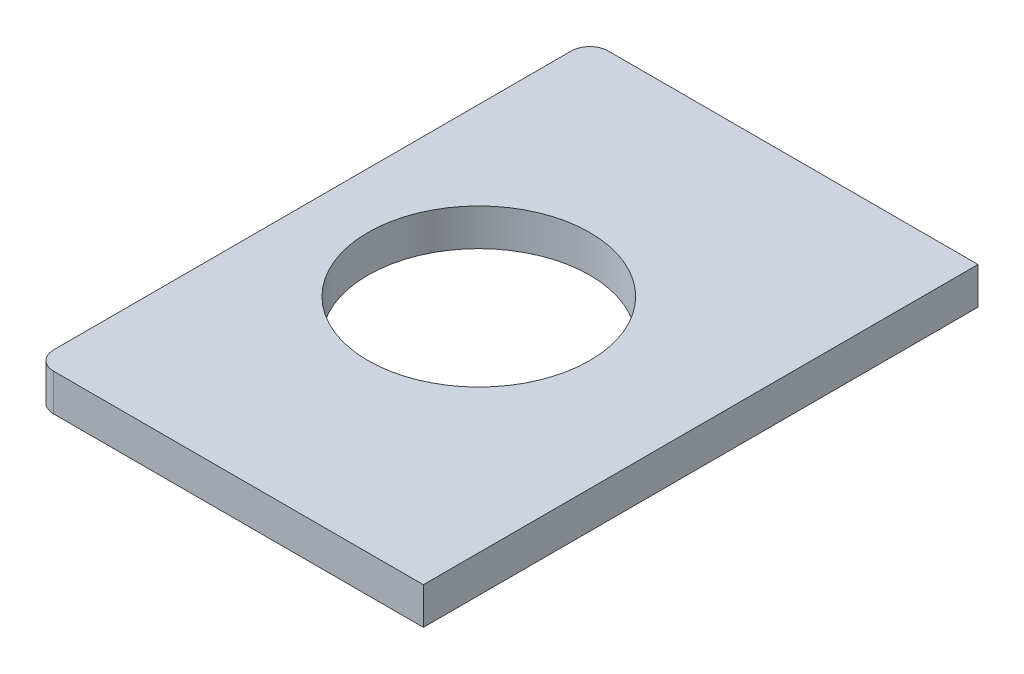
ISO-10303-21;
HEADER;
FILE_DESCRIPTION(('STEP AP214'),'2;1');
FILE_NAME('part.step','',(''),(''),'','','');
FILE_SCHEMA(('AUTOMOTIVE_DESIGN { 1 0 10303 214 1 1 1 1 }'));
ENDSEC;
DATA;
#1=APPLICATION_CONTEXT('core data for automotive mechanical design processes');
#2=APPLICATION_PROTOCOL_DEFINITION('international standard','automotive_design',2000,#1);
#3=PRODUCT_CONTEXT('',#1,'mechanical');
#4=PRODUCT('Part','Part','',(#3));
#5=PRODUCT_RELATED_PRODUCT_CATEGORY('part','',(#4));
#6=PRODUCT_DEFINITION_FORMATION('','',#4);
#7=PRODUCT_DEFINITION_CONTEXT('part definition',#1,'design');
#8=PRODUCT_DEFINITION('design','',#6,#7);
#9=PRODUCT_DEFINITION_SHAPE('','',#8);
#10=(LENGTH_UNIT() NAMED_UNIT(*) SI_UNIT(.MILLI.,.METRE.));
#11=(NAMED_UNIT(*) PLANE_ANGLE_UNIT() SI_UNIT($,.RADIAN.));
#12=(NAMED_UNIT(*) SI_UNIT($,.STERADIAN.) SOLID_ANGLE_UNIT());
#13=UNCERTAINTY_MEASURE_WITH_UNIT(LENGTH_MEASURE(1.E-05),#10,'distance_accuracy_value','');
#14=(GEOMETRIC_REPRESENTATION_CONTEXT(3) GLOBAL_UNCERTAINTY_ASSIGNED_CONTEXT((#13)) GLOBAL_UNIT_ASSIGNED_CONTEXT((#10,
#11,#12)) REPRESENTATION_CONTEXT('',''));
#15=CARTESIAN_POINT('',(0.,0.,0.));
#16=DIRECTION('',(0.,0.,1.));
#17=DIRECTION('',(1.,0.,0.));
#18=AXIS2_PLACEMENT_3D('',#15,#16,#17);
#19=CARTESIAN_POINT('',(10.5,2.,-15.));
#20=DIRECTION('',(-1.,0.,0.));
#21=DIRECTION('',(0.,0.,1.));
#22=AXIS2_PLACEMENT_3D('',#19,#20,#21);
#23=PLANE('',#22);
#24=DIRECTION('',(0.,0.,-1.));
#25=VECTOR('',#24,1.);
#26=CARTESIAN_POINT('',(10.5,0.,-15.));
#27=LINE('',#26,#25);
#28=CARTESIAN_POINT('',(10.5,0.,15.));
#29=VERTEX_POINT('',#28);
#30=CARTESIAN_POINT('',(10.5,0.,-15.));
#31=VERTEX_POINT('',#30);
#32=EDGE_CURVE('E136',#29,#31,#27,.T.);
#33=ORIENTED_EDGE('',*,*,#32,.T.);
#34=DIRECTION('',(0.,-1.,0.));
#35=VECTOR('',#34,1.);
#36=CARTESIAN_POINT('',(10.5,2.,-15.));
#37=LINE('',#36,#35);
#38=CARTESIAN_POINT('',(10.5,2.,-15.));
#39=VERTEX_POINT('',#38);
#40=EDGE_CURVE('E102',#39,#31,#37,.T.);
#41=ORIENTED_EDGE('',*,*,#40,.F.);
#42=DIRECTION('',(0.,0.,-1.));
#43=VECTOR('',#42,1.);
#44=CARTESIAN_POINT('',(10.5,2.,-15.));
#45=LINE('',#44,#43);
#46=CARTESIAN_POINT('',(10.5,2.,15.));
#47=VERTEX_POINT('',#46);
#48=EDGE_CURVE('E89',#47,#39,#45,.T.);
#49=ORIENTED_EDGE('',*,*,#48,.F.);
#50=DIRECTION('',(0.,-1.,0.));
#51=VECTOR('',#50,1.);
#52=CARTESIAN_POINT('',(10.5,2.,15.));
#53=LINE('',#52,#51);
#54=EDGE_CURVE('E100',#47,#29,#53,.T.);
#55=ORIENTED_EDGE('',*,*,#54,.T.);
#56=EDGE_LOOP('',(#33,#41,#49,#55));
#57=FACE_BOUND('',#56,.T.);
#58=ADVANCED_FACE('F32',(#57),#23,.F.);
#59=CARTESIAN_POINT('',(-10.5,2.,-15.));
#60=DIRECTION('',(0.,0.,1.));
#61=DIRECTION('',(1.,0.,0.));
#62=AXIS2_PLACEMENT_3D('',#59,#60,#61);
#63=PLANE('',#62);
#64=DIRECTION('',(-1.,0.,0.));
#65=VECTOR('',#64,1.);
#66=CARTESIAN_POINT('',(-10.5,0.,-15.));
#67=LINE('',#66,#65);
#68=CARTESIAN_POINT('',(-9.5,0.,-15.));
#69=VERTEX_POINT('',#68);
#70=EDGE_CURVE('E133',#31,#69,#67,.T.);
#71=ORIENTED_EDGE('',*,*,#70,.T.);
#72=DIRECTION('',(0.,-1.,0.));
#73=VECTOR('',#72,1.);
#74=CARTESIAN_POINT('',(-9.5,2.,-15.));
#75=LINE('',#74,#73);
#76=CARTESIAN_POINT('',(-9.5,2.,-15.));
#77=VERTEX_POINT('',#76);
#78=EDGE_CURVE('E11',#69,#77,#75,.F.);
#79=ORIENTED_EDGE('',*,*,#78,.T.);
#80=DIRECTION('',(-1.,0.,0.));
#81=VECTOR('',#80,1.);
#82=CARTESIAN_POINT('',(-10.5,2.,-15.));
#83=LINE('',#82,#81);
#84=EDGE_CURVE('E103',#39,#77,#83,.T.);
#85=ORIENTED_EDGE('',*,*,#84,.F.);
#86=ORIENTED_EDGE('',*,*,#40,.T.);
#87=EDGE_LOOP('',(#71,#79,#85,#86));
#88=FACE_BOUND('',#87,.T.);
#89=ADVANCED_FACE('F135',(#88),#63,.F.);
#90=CARTESIAN_POINT('',(-10.5,2.,15.));
#91=DIRECTION('',(1.,0.,0.));
#92=DIRECTION('',(0.,0.,-1.));
#93=AXIS2_PLACEMENT_3D('',#90,#91,#92);
#94=PLANE('',#93);
#95=DIRECTION('',(0.,0.,1.));
#96=VECTOR('',#95,1.);
#97=CARTESIAN_POINT('',(-10.5,0.,15.));
#98=LINE('',#97,#96);
#99=CARTESIAN_POINT('',(-10.5,0.,-14.));
#100=VERTEX_POINT('',#99);
#101=CARTESIAN_POINT('',(-10.5,0.,14.));
#102=VERTEX_POINT('',#101);
#103=EDGE_CURVE('E134',#100,#102,#98,.T.);
#104=ORIENTED_EDGE('',*,*,#103,.T.);
#105=DIRECTION('',(0.,-1.,0.));
#106=VECTOR('',#105,1.);
#107=CARTESIAN_POINT('',(-10.5,2.,14.));
#108=LINE('',#107,#106);
#109=CARTESIAN_POINT('',(-10.5,2.,14.));
#110=VERTEX_POINT('',#109);
#111=EDGE_CURVE('E53',#102,#110,#108,.F.);
#112=ORIENTED_EDGE('',*,*,#111,.T.);
#113=DIRECTION('',(0.,0.,1.));
#114=VECTOR('',#113,1.);
#115=CARTESIAN_POINT('',(-10.5,2.,15.));
#116=LINE('',#115,#114);
#117=CARTESIAN_POINT('',(-10.5,2.,-14.));
#118=VERTEX_POINT('',#117);
#119=EDGE_CURVE('E112',#118,#110,#116,.T.);
#120=ORIENTED_EDGE('',*,*,#119,.F.);
#121=DIRECTION('',(0.,-1.,0.));
#122=VECTOR('',#121,1.);
#123=CARTESIAN_POINT('',(-10.5,2.,-14.));
#124=LINE('',#123,#122);
#125=EDGE_CURVE('E119',#118,#100,#124,.T.);
#126=ORIENTED_EDGE('',*,*,#125,.T.);
#127=EDGE_LOOP('',(#104,#112,#120,#126));
#128=FACE_BOUND('',#127,.T.);
#129=ADVANCED_FACE('F127',(#128),#94,.F.);
#130=CARTESIAN_POINT('',(0.,2.,15.));
#131=DIRECTION('',(0.,0.,-1.));
#132=DIRECTION('',(-1.,0.,0.));
#133=AXIS2_PLACEMENT_3D('',#130,#131,#132);
#134=PLANE('',#133);
#135=DIRECTION('',(1.,0.,0.));
#136=VECTOR('',#135,1.);
#137=CARTESIAN_POINT('',(10.5,2.,15.));
#138=LINE('',#137,#136);
#139=CARTESIAN_POINT('',(-9.49999999999999,2.,15.));
#140=VERTEX_POINT('',#139);
#141=EDGE_CURVE('E86',#140,#47,#138,.T.);
#142=ORIENTED_EDGE('',*,*,#141,.F.);
#143=DIRECTION('',(0.,-1.,0.));
#144=VECTOR('',#143,1.);
#145=CARTESIAN_POINT('',(-9.5,2.,15.));
#146=LINE('',#145,#144);
#147=CARTESIAN_POINT('',(-9.49999999999999,0.,15.));
#148=VERTEX_POINT('',#147);
#149=EDGE_CURVE('E108',#140,#148,#146,.T.);
#150=ORIENTED_EDGE('',*,*,#149,.T.);
#151=DIRECTION('',(1.,0.,0.));
#152=VECTOR('',#151,1.);
#153=CARTESIAN_POINT('',(0.,0.,15.));
#154=LINE('',#153,#152);
#155=EDGE_CURVE('E96',#148,#29,#154,.T.);
#156=ORIENTED_EDGE('',*,*,#155,.T.);
#157=ORIENTED_EDGE('',*,*,#54,.F.);
#158=EDGE_LOOP('',(#142,#150,#156,#157));
#159=FACE_BOUND('',#158,.T.);
#160=ADVANCED_FACE('F105',(#159),#134,.F.);
#161=CARTESIAN_POINT('',(0.,2.,0.));
#162=DIRECTION('',(0.,-1.,0.));
#163=DIRECTION('',(0.,0.,-1.));
#164=AXIS2_PLACEMENT_3D('',#161,#162,#163);
#165=PLANE('',#164);
#166=CARTESIAN_POINT('',(-1.5,2.,0.));
#167=DIRECTION('',(0.,1.,0.));
#168=DIRECTION('',(0.,0.,1.));
#169=AXIS2_PLACEMENT_3D('',#166,#167,#168);
#170=CIRCLE('',#169,6.);
#171=CARTESIAN_POINT('',(-1.5,2.,6.));
#172=VERTEX_POINT('',#171);
#173=EDGE_CURVE('E143',#172,#172,#170,.T.);
#174=ORIENTED_EDGE('',*,*,#173,.F.);
#175=EDGE_LOOP('',(#174));
#176=FACE_BOUND('',#175,.T.);
#177=ORIENTED_EDGE('',*,*,#119,.T.);
#178=CARTESIAN_POINT('',(-9.5,2.,14.));
#179=DIRECTION('',(0.,-1.,0.));
#180=DIRECTION('',(0.,0.,-1.));
#181=AXIS2_PLACEMENT_3D('',#178,#179,#180);
#182=CIRCLE('',#181,1.);
#183=EDGE_CURVE('E40',#110,#140,#182,.F.);
#184=ORIENTED_EDGE('',*,*,#183,.T.);
#185=ORIENTED_EDGE('',*,*,#141,.T.);
#186=ORIENTED_EDGE('',*,*,#48,.T.);
#187=ORIENTED_EDGE('',*,*,#84,.T.);
#188=CARTESIAN_POINT('',(-9.5,2.,-14.));
#189=DIRECTION('',(0.,-1.,0.));
#190=DIRECTION('',(0.,0.,-1.));
#191=AXIS2_PLACEMENT_3D('',#188,#189,#190);
#192=CIRCLE('',#191,1.);
#193=EDGE_CURVE('E123',#77,#118,#192,.F.);
#194=ORIENTED_EDGE('',*,*,#193,.T.);
#195=EDGE_LOOP('',(#177,#184,#185,#186,#187,#194));
#196=FACE_BOUND('',#195,.T.);
#197=ADVANCED_FACE('F88',(#176,#196),#165,.F.);
#198=CARTESIAN_POINT('',(0.,0.,0.));
#199=DIRECTION('',(0.,-1.,0.));
#200=DIRECTION('',(0.,0.,-1.));
#201=AXIS2_PLACEMENT_3D('',#198,#199,#200);
#202=PLANE('',#201);
#203=CARTESIAN_POINT('',(-1.5,0.,0.));
#204=DIRECTION('',(0.,1.,0.));
#205=DIRECTION('',(0.,0.,1.));
#206=AXIS2_PLACEMENT_3D('',#203,#204,#205);
#207=CIRCLE('',#206,6.);
#208=CARTESIAN_POINT('',(-1.5,0.,6.));
#209=VERTEX_POINT('',#208);
#210=EDGE_CURVE('E139',#209,#209,#207,.T.);
#211=ORIENTED_EDGE('',*,*,#210,.T.);
#212=EDGE_LOOP('',(#211));
#213=FACE_BOUND('',#212,.T.);
#214=ORIENTED_EDGE('',*,*,#155,.F.);
#215=CARTESIAN_POINT('',(-9.5,0.,14.));
#216=DIRECTION('',(0.,-1.,0.));
#217=DIRECTION('',(0.,0.,-1.));
#218=AXIS2_PLACEMENT_3D('',#215,#216,#217);
#219=CIRCLE('',#218,1.);
#220=EDGE_CURVE('E117',#148,#102,#219,.T.);
#221=ORIENTED_EDGE('',*,*,#220,.T.);
#222=ORIENTED_EDGE('',*,*,#103,.F.);
#223=CARTESIAN_POINT('',(-9.5,0.,-14.));
#224=DIRECTION('',(0.,-1.,0.));
#225=DIRECTION('',(0.,0.,-1.));
#226=AXIS2_PLACEMENT_3D('',#223,#224,#225);
#227=CIRCLE('',#226,1.);
#228=EDGE_CURVE('E110',#100,#69,#227,.T.);
#229=ORIENTED_EDGE('',*,*,#228,.T.);
#230=ORIENTED_EDGE('',*,*,#70,.F.);
#231=ORIENTED_EDGE('',*,*,#32,.F.);
#232=EDGE_LOOP('',(#214,#221,#222,#229,#230,#231));
#233=FACE_BOUND('',#232,.T.);
#234=ADVANCED_FACE('F132',(#213,#233),#202,.T.);
#235=CARTESIAN_POINT('',(-9.5,2.,14.));
#236=DIRECTION('',(0.,-1.,0.));
#237=DIRECTION('',(0.,0.,-1.));
#238=AXIS2_PLACEMENT_3D('',#235,#236,#237);
#239=CYLINDRICAL_SURFACE('',#238,1.);
#240=ORIENTED_EDGE('',*,*,#183,.F.);
#241=ORIENTED_EDGE('',*,*,#111,.F.);
#242=ORIENTED_EDGE('',*,*,#220,.F.);
#243=ORIENTED_EDGE('',*,*,#149,.F.);
#244=EDGE_LOOP('',(#240,#241,#242,#243));
#245=FACE_BOUND('',#244,.T.);
#246=ADVANCED_FACE('F162',(#245),#239,.T.);
#247=CARTESIAN_POINT('',(-9.5,2.,-14.));
#248=DIRECTION('',(0.,-1.,0.));
#249=DIRECTION('',(0.,0.,-1.));
#250=AXIS2_PLACEMENT_3D('',#247,#248,#249);
#251=CYLINDRICAL_SURFACE('',#250,1.);
#252=ORIENTED_EDGE('',*,*,#193,.F.);
#253=ORIENTED_EDGE('',*,*,#78,.F.);
#254=ORIENTED_EDGE('',*,*,#228,.F.);
#255=ORIENTED_EDGE('',*,*,#125,.F.);
#256=EDGE_LOOP('',(#252,#253,#254,#255));
#257=FACE_BOUND('',#256,.T.);
#258=ADVANCED_FACE('F34',(#257),#251,.T.);
#259=CARTESIAN_POINT('',(-1.5,0.,0.));
#260=DIRECTION('',(0.,1.,0.));
#261=DIRECTION('',(0.,0.,1.));
#262=AXIS2_PLACEMENT_3D('',#259,#260,#261);
#263=CYLINDRICAL_SURFACE('',#262,6.);
#264=ORIENTED_EDGE('',*,*,#210,.F.);
#265=EDGE_LOOP('',(#264));
#266=FACE_BOUND('',#265,.T.);
#267=ORIENTED_EDGE('',*,*,#173,.T.);
#268=EDGE_LOOP('',(#267));
#269=FACE_BOUND('',#268,.T.);
#270=ADVANCED_FACE('F150',(#266,#269),#263,.F.);
#271=CLOSED_SHELL('',(#58,#89,#129,#160,#197,#234,#246,#258,#270));
#272=MANIFOLD_SOLID_BREP('B2',#271);
#273=ADVANCED_BREP_SHAPE_REPRESENTATION('',(#18,#272),#14);
#274=SHAPE_DEFINITION_REPRESENTATION(#9,#273);
ENDSEC;
END-ISO-10303-21;
